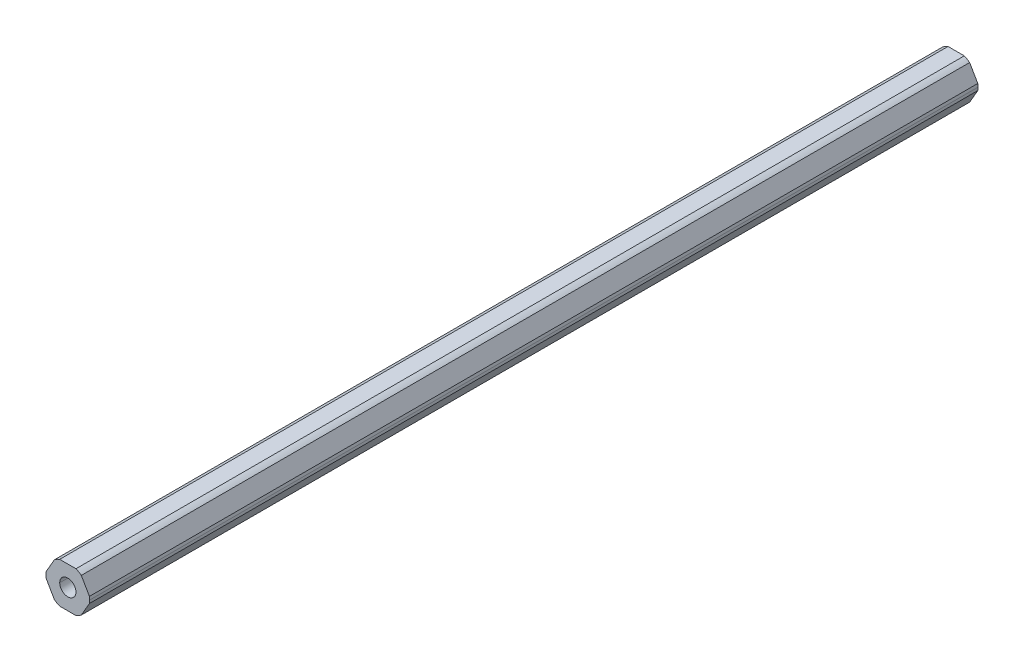
ISO-10303-21;
HEADER;
FILE_DESCRIPTION(('STEP AP214'),'2;1');
FILE_NAME('part.step','',(''),(''),'','','');
FILE_SCHEMA(('AUTOMOTIVE_DESIGN { 1 0 10303 214 1 1 1 1 }'));
ENDSEC;
DATA;
#1=APPLICATION_CONTEXT('core data for automotive mechanical design processes');
#2=APPLICATION_PROTOCOL_DEFINITION('international standard','automotive_design',2000,#1);
#3=PRODUCT_CONTEXT('',#1,'mechanical');
#4=PRODUCT('Part','Part','',(#3));
#5=PRODUCT_RELATED_PRODUCT_CATEGORY('part','',(#4));
#6=PRODUCT_DEFINITION_FORMATION('','',#4);
#7=PRODUCT_DEFINITION_CONTEXT('part definition',#1,'design');
#8=PRODUCT_DEFINITION('design','',#6,#7);
#9=PRODUCT_DEFINITION_SHAPE('','',#8);
#10=(LENGTH_UNIT() NAMED_UNIT(*) SI_UNIT(.MILLI.,.METRE.));
#11=(NAMED_UNIT(*) PLANE_ANGLE_UNIT() SI_UNIT($,.RADIAN.));
#12=(NAMED_UNIT(*) SI_UNIT($,.STERADIAN.) SOLID_ANGLE_UNIT());
#13=UNCERTAINTY_MEASURE_WITH_UNIT(LENGTH_MEASURE(1.E-05),#10,'distance_accuracy_value','');
#14=(GEOMETRIC_REPRESENTATION_CONTEXT(3) GLOBAL_UNCERTAINTY_ASSIGNED_CONTEXT((#13)) GLOBAL_UNIT_ASSIGNED_CONTEXT((#10,
#11,#12)) REPRESENTATION_CONTEXT('',''));
#15=CARTESIAN_POINT('',(0.,0.,0.));
#16=DIRECTION('',(0.,0.,1.));
#17=DIRECTION('',(1.,0.,0.));
#18=AXIS2_PLACEMENT_3D('',#15,#16,#17);
#19=CARTESIAN_POINT('',(0.,0.,-228.6));
#20=DIRECTION('',(0.,0.,1.));
#21=DIRECTION('',(1.,0.,0.));
#22=AXIS2_PLACEMENT_3D('',#19,#20,#21);
#23=CYLINDRICAL_SURFACE('',#22,2.55);
#24=CARTESIAN_POINT('',(0.,0.,-50.8));
#25=DIRECTION('',(0.,0.,-1.));
#26=DIRECTION('',(-1.,0.,0.));
#27=AXIS2_PLACEMENT_3D('',#24,#25,#26);
#28=CIRCLE('',#27,2.55);
#29=CARTESIAN_POINT('',(-2.55,0.,-50.8));
#30=VERTEX_POINT('',#29);
#31=CARTESIAN_POINT('',(2.55,0.,-50.8));
#32=VERTEX_POINT('',#31);
#33=EDGE_CURVE('E55',#30,#32,#28,.F.);
#34=ORIENTED_EDGE('',*,*,#33,.F.);
#35=DIRECTION('',(0.,0.,1.));
#36=VECTOR('',#35,1.);
#37=CARTESIAN_POINT('',(-2.55,0.,-228.6));
#38=LINE('',#37,#36);
#39=CARTESIAN_POINT('',(-2.55,0.,228.6));
#40=VERTEX_POINT('',#39);
#41=EDGE_CURVE('E42',#30,#40,#38,.T.);
#42=ORIENTED_EDGE('',*,*,#41,.T.);
#43=CARTESIAN_POINT('',(0.,0.,228.6));
#44=DIRECTION('',(0.,0.,1.));
#45=DIRECTION('',(1.,0.,0.));
#46=AXIS2_PLACEMENT_3D('',#43,#44,#45);
#47=CIRCLE('',#46,2.55);
#48=CARTESIAN_POINT('',(2.55,0.,228.6));
#49=VERTEX_POINT('',#48);
#50=EDGE_CURVE('E166',#40,#49,#47,.T.);
#51=ORIENTED_EDGE('',*,*,#50,.T.);
#52=DIRECTION('',(0.,0.,1.));
#53=VECTOR('',#52,1.);
#54=CARTESIAN_POINT('',(2.55,0.,-228.6));
#55=LINE('',#54,#53);
#56=EDGE_CURVE('E159',#32,#49,#55,.T.);
#57=ORIENTED_EDGE('',*,*,#56,.F.);
#58=EDGE_LOOP('',(#34,#42,#51,#57));
#59=FACE_BOUND('',#58,.T.);
#60=ADVANCED_FACE('F34',(#59),#23,.F.);
#61=CARTESIAN_POINT('',(0.,0.,-228.6));
#62=DIRECTION('',(0.,0.,1.));
#63=DIRECTION('',(1.,0.,0.));
#64=AXIS2_PLACEMENT_3D('',#61,#62,#63);
#65=CYLINDRICAL_SURFACE('',#64,6.87);
#66=DIRECTION('',(0.,0.,-1.));
#67=VECTOR('',#66,1.);
#68=CARTESIAN_POINT('',(6.80102150534208,-0.971085209378962,-228.6));
#69=LINE('',#68,#67);
#70=CARTESIAN_POINT('',(6.80102150534208,-0.971085209378955,228.6));
#71=VERTEX_POINT('',#70);
#72=CARTESIAN_POINT('',(6.80102150534208,-0.971085209378955,-50.8));
#73=VERTEX_POINT('',#72);
#74=EDGE_CURVE('E197',#71,#73,#69,.T.);
#75=ORIENTED_EDGE('',*,*,#74,.T.);
#76=CARTESIAN_POINT('',(0.,0.,-50.8));
#77=DIRECTION('',(0.,0.,-1.));
#78=DIRECTION('',(-1.,0.,0.));
#79=AXIS2_PLACEMENT_3D('',#76,#77,#78);
#80=CIRCLE('',#79,6.87);
#81=CARTESIAN_POINT('',(6.87,0.,-50.8));
#82=VERTEX_POINT('',#81);
#83=EDGE_CURVE('E302',#73,#82,#80,.F.);
#84=ORIENTED_EDGE('',*,*,#83,.T.);
#85=DIRECTION('',(0.,0.,1.));
#86=VECTOR('',#85,1.);
#87=CARTESIAN_POINT('',(6.87,0.,-228.6));
#88=LINE('',#87,#86);
#89=CARTESIAN_POINT('',(6.87,0.,228.6));
#90=VERTEX_POINT('',#89);
#91=EDGE_CURVE('E169',#82,#90,#88,.T.);
#92=ORIENTED_EDGE('',*,*,#91,.T.);
#93=CARTESIAN_POINT('',(0.,0.,228.6));
#94=DIRECTION('',(0.,0.,1.));
#95=DIRECTION('',(1.,0.,0.));
#96=AXIS2_PLACEMENT_3D('',#93,#94,#95);
#97=CIRCLE('',#96,6.87);
#98=EDGE_CURVE('E181',#71,#90,#97,.T.);
#99=ORIENTED_EDGE('',*,*,#98,.F.);
#100=EDGE_LOOP('',(#75,#84,#92,#99));
#101=FACE_BOUND('',#100,.T.);
#102=ADVANCED_FACE('F300',(#101),#65,.T.);
#103=CARTESIAN_POINT('',(3.68083890619154,-6.3754,228.6));
#104=DIRECTION('',(-0.866025403784439,0.5,0.));
#105=DIRECTION('',(0.,0.,1.));
#106=AXIS2_PLACEMENT_3D('',#103,#104,#105);
#107=PLANE('',#106);
#108=DIRECTION('',(-0.5,-0.866025403784439,0.));
#109=VECTOR('',#108,1.);
#110=CARTESIAN_POINT('',(3.68083890619154,-6.3754,-50.8));
#111=LINE('',#110,#109);
#112=CARTESIAN_POINT('',(4.24149521323254,-5.40431479062105,-50.8));
#113=VERTEX_POINT('',#112);
#114=EDGE_CURVE('E314',#73,#113,#111,.T.);
#115=ORIENTED_EDGE('',*,*,#114,.F.);
#116=ORIENTED_EDGE('',*,*,#74,.F.);
#117=DIRECTION('',(0.5,0.866025403784439,0.));
#118=VECTOR('',#117,1.);
#119=CARTESIAN_POINT('',(3.68083890619154,-6.3754,228.6));
#120=LINE('',#119,#118);
#121=CARTESIAN_POINT('',(4.24149521323254,-5.40431479062105,228.6));
#122=VERTEX_POINT('',#121);
#123=EDGE_CURVE('E185',#122,#71,#120,.T.);
#124=ORIENTED_EDGE('',*,*,#123,.F.);
#125=DIRECTION('',(0.,0.,1.));
#126=VECTOR('',#125,1.);
#127=CARTESIAN_POINT('',(4.24149521323255,-5.40431479062104,-228.6));
#128=LINE('',#127,#126);
#129=EDGE_CURVE('E204',#113,#122,#128,.T.);
#130=ORIENTED_EDGE('',*,*,#129,.F.);
#131=EDGE_LOOP('',(#115,#116,#124,#130));
#132=FACE_BOUND('',#131,.T.);
#133=ADVANCED_FACE('F359',(#132),#107,.F.);
#134=CARTESIAN_POINT('',(7.36167781238308,0.,228.6));
#135=DIRECTION('',(-0.866025403784439,-0.5,0.));
#136=DIRECTION('',(-0.5,0.866025403784439,0.));
#137=AXIS2_PLACEMENT_3D('',#134,#135,#136);
#138=PLANE('',#137);
#139=DIRECTION('',(0.5,-0.866025403784439,0.));
#140=VECTOR('',#139,1.);
#141=CARTESIAN_POINT('',(7.36167781238308,0.,-50.8));
#142=LINE('',#141,#140);
#143=CARTESIAN_POINT('',(4.24149521323254,5.40431479062105,-50.8));
#144=VERTEX_POINT('',#143);
#145=CARTESIAN_POINT('',(6.80102150534208,0.97108520937895,-50.8));
#146=VERTEX_POINT('',#145);
#147=EDGE_CURVE('E279',#144,#146,#142,.T.);
#148=ORIENTED_EDGE('',*,*,#147,.F.);
#149=DIRECTION('',(0.,0.,-1.));
#150=VECTOR('',#149,1.);
#151=CARTESIAN_POINT('',(4.24149521323254,5.40431479062105,-228.6));
#152=LINE('',#151,#150);
#153=CARTESIAN_POINT('',(4.24149521323254,5.40431479062105,228.6));
#154=VERTEX_POINT('',#153);
#155=EDGE_CURVE('E175',#154,#144,#152,.T.);
#156=ORIENTED_EDGE('',*,*,#155,.F.);
#157=DIRECTION('',(-0.5,0.866025403784439,0.));
#158=VECTOR('',#157,1.);
#159=CARTESIAN_POINT('',(7.36167781238308,0.,228.6));
#160=LINE('',#159,#158);
#161=CARTESIAN_POINT('',(6.80102150534208,0.97108520937895,228.6));
#162=VERTEX_POINT('',#161);
#163=EDGE_CURVE('E193',#162,#154,#160,.T.);
#164=ORIENTED_EDGE('',*,*,#163,.F.);
#165=DIRECTION('',(0.,0.,1.));
#166=VECTOR('',#165,1.);
#167=CARTESIAN_POINT('',(6.80102150534208,0.971085209378949,-228.6));
#168=LINE('',#167,#166);
#169=EDGE_CURVE('E203',#146,#162,#168,.T.);
#170=ORIENTED_EDGE('',*,*,#169,.F.);
#171=EDGE_LOOP('',(#148,#156,#164,#170));
#172=FACE_BOUND('',#171,.T.);
#173=ADVANCED_FACE('F278',(#172),#138,.F.);
#174=CARTESIAN_POINT('',(3.68083890619154,6.3754,228.6));
#175=DIRECTION('',(0.,-1.,0.));
#176=DIRECTION('',(0.,0.,-1.));
#177=AXIS2_PLACEMENT_3D('',#174,#175,#176);
#178=PLANE('',#177);
#179=DIRECTION('',(1.,0.,0.));
#180=VECTOR('',#179,1.);
#181=CARTESIAN_POINT('',(3.68083890619154,6.3754,-50.8));
#182=LINE('',#181,#180);
#183=CARTESIAN_POINT('',(-2.55952629210953,6.3754,-50.8));
#184=VERTEX_POINT('',#183);
#185=CARTESIAN_POINT('',(2.55952629210952,6.3754,-50.8));
#186=VERTEX_POINT('',#185);
#187=EDGE_CURVE('E49',#184,#186,#182,.T.);
#188=ORIENTED_EDGE('',*,*,#187,.F.);
#189=DIRECTION('',(0.,0.,-1.));
#190=VECTOR('',#189,1.);
#191=CARTESIAN_POINT('',(-2.55952629210953,6.3754,-228.6));
#192=LINE('',#191,#190);
#193=CARTESIAN_POINT('',(-2.55952629210953,6.3754,228.6));
#194=VERTEX_POINT('',#193);
#195=EDGE_CURVE('E173',#194,#184,#192,.T.);
#196=ORIENTED_EDGE('',*,*,#195,.F.);
#197=DIRECTION('',(-1.,0.,0.));
#198=VECTOR('',#197,1.);
#199=CARTESIAN_POINT('',(3.68083890619154,6.3754,228.6));
#200=LINE('',#199,#198);
#201=CARTESIAN_POINT('',(2.55952629210952,6.3754,228.6));
#202=VERTEX_POINT('',#201);
#203=EDGE_CURVE('E202',#202,#194,#200,.T.);
#204=ORIENTED_EDGE('',*,*,#203,.F.);
#205=DIRECTION('',(0.,0.,1.));
#206=VECTOR('',#205,1.);
#207=CARTESIAN_POINT('',(2.55952629210952,6.3754,-228.6));
#208=LINE('',#207,#206);
#209=EDGE_CURVE('E180',#186,#202,#208,.T.);
#210=ORIENTED_EDGE('',*,*,#209,.F.);
#211=EDGE_LOOP('',(#188,#196,#204,#210));
#212=FACE_BOUND('',#211,.T.);
#213=ADVANCED_FACE('F345',(#212),#178,.F.);
#214=CARTESIAN_POINT('',(-3.68083890619154,6.3754,228.6));
#215=DIRECTION('',(0.866025403784439,-0.5,0.));
#216=DIRECTION('',(0.,0.,-1.));
#217=AXIS2_PLACEMENT_3D('',#214,#215,#216);
#218=PLANE('',#217);
#219=DIRECTION('',(0.5,0.866025403784439,0.));
#220=VECTOR('',#219,1.);
#221=CARTESIAN_POINT('',(-3.68083890619154,6.3754,-50.8));
#222=LINE('',#221,#220);
#223=CARTESIAN_POINT('',(-6.80102150534207,0.97108520937896,-50.8));
#224=VERTEX_POINT('',#223);
#225=CARTESIAN_POINT('',(-4.24149521323255,5.40431479062105,-50.8));
#226=VERTEX_POINT('',#225);
#227=EDGE_CURVE('E305',#224,#226,#222,.T.);
#228=ORIENTED_EDGE('',*,*,#227,.F.);
#229=DIRECTION('',(0.,0.,-1.));
#230=VECTOR('',#229,1.);
#231=CARTESIAN_POINT('',(-6.80102150534208,0.97108520937896,-228.6));
#232=LINE('',#231,#230);
#233=CARTESIAN_POINT('',(-6.80102150534208,0.97108520937896,228.6));
#234=VERTEX_POINT('',#233);
#235=EDGE_CURVE('E229',#234,#224,#232,.T.);
#236=ORIENTED_EDGE('',*,*,#235,.F.);
#237=DIRECTION('',(-0.5,-0.866025403784439,0.));
#238=VECTOR('',#237,1.);
#239=CARTESIAN_POINT('',(-3.68083890619154,6.3754,228.6));
#240=LINE('',#239,#238);
#241=CARTESIAN_POINT('',(-4.24149521323255,5.40431479062105,228.6));
#242=VERTEX_POINT('',#241);
#243=EDGE_CURVE('E249',#242,#234,#240,.T.);
#244=ORIENTED_EDGE('',*,*,#243,.F.);
#245=DIRECTION('',(0.,0.,1.));
#246=VECTOR('',#245,1.);
#247=CARTESIAN_POINT('',(-4.24149521323255,5.40431479062105,-228.6));
#248=LINE('',#247,#246);
#249=EDGE_CURVE('E179',#226,#242,#248,.T.);
#250=ORIENTED_EDGE('',*,*,#249,.F.);
#251=EDGE_LOOP('',(#228,#236,#244,#250));
#252=FACE_BOUND('',#251,.T.);
#253=ADVANCED_FACE('F339',(#252),#218,.F.);
#254=CARTESIAN_POINT('',(-7.36167781238308,0.,228.6));
#255=DIRECTION('',(0.866025403784439,0.5,0.));
#256=DIRECTION('',(0.,0.,-1.));
#257=AXIS2_PLACEMENT_3D('',#254,#255,#256);
#258=PLANE('',#257);
#259=DIRECTION('',(-0.5,0.866025403784439,0.));
#260=VECTOR('',#259,1.);
#261=CARTESIAN_POINT('',(-7.36167781238308,0.,-50.8));
#262=LINE('',#261,#260);
#263=CARTESIAN_POINT('',(-4.24149521323254,-5.40431479062105,-50.8));
#264=VERTEX_POINT('',#263);
#265=CARTESIAN_POINT('',(-6.80102150534208,-0.971085209378956,-50.8));
#266=VERTEX_POINT('',#265);
#267=EDGE_CURVE('E308',#264,#266,#262,.T.);
#268=ORIENTED_EDGE('',*,*,#267,.F.);
#269=DIRECTION('',(0.,0.,-1.));
#270=VECTOR('',#269,1.);
#271=CARTESIAN_POINT('',(-4.24149521323255,-5.40431479062104,-228.6));
#272=LINE('',#271,#270);
#273=CARTESIAN_POINT('',(-4.24149521323254,-5.40431479062105,228.6));
#274=VERTEX_POINT('',#273);
#275=EDGE_CURVE('E238',#274,#264,#272,.T.);
#276=ORIENTED_EDGE('',*,*,#275,.F.);
#277=DIRECTION('',(0.5,-0.866025403784439,0.));
#278=VECTOR('',#277,1.);
#279=CARTESIAN_POINT('',(-7.36167781238308,0.,228.6));
#280=LINE('',#279,#278);
#281=CARTESIAN_POINT('',(-6.80102150534208,-0.971085209378956,228.6));
#282=VERTEX_POINT('',#281);
#283=EDGE_CURVE('E187',#282,#274,#280,.T.);
#284=ORIENTED_EDGE('',*,*,#283,.F.);
#285=DIRECTION('',(0.,0.,1.));
#286=VECTOR('',#285,1.);
#287=CARTESIAN_POINT('',(-6.80102150534208,-0.971085209378962,-228.6));
#288=LINE('',#287,#286);
#289=EDGE_CURVE('E233',#266,#282,#288,.T.);
#290=ORIENTED_EDGE('',*,*,#289,.F.);
#291=EDGE_LOOP('',(#268,#276,#284,#290));
#292=FACE_BOUND('',#291,.T.);
#293=ADVANCED_FACE('F334',(#292),#258,.F.);
#294=CARTESIAN_POINT('',(-3.68083890619154,-6.3754,228.6));
#295=DIRECTION('',(0.,1.,0.));
#296=DIRECTION('',(1.,0.,0.));
#297=AXIS2_PLACEMENT_3D('',#294,#295,#296);
#298=PLANE('',#297);
#299=DIRECTION('',(-1.,0.,0.));
#300=VECTOR('',#299,1.);
#301=CARTESIAN_POINT('',(-3.68083890619154,-6.3754,-50.8));
#302=LINE('',#301,#300);
#303=CARTESIAN_POINT('',(2.55952629210953,-6.3754,-50.8));
#304=VERTEX_POINT('',#303);
#305=CARTESIAN_POINT('',(-2.55952629210953,-6.3754,-50.8));
#306=VERTEX_POINT('',#305);
#307=EDGE_CURVE('E254',#304,#306,#302,.T.);
#308=ORIENTED_EDGE('',*,*,#307,.F.);
#309=DIRECTION('',(0.,0.,-1.));
#310=VECTOR('',#309,1.);
#311=CARTESIAN_POINT('',(2.55952629210953,-6.3754,-228.6));
#312=LINE('',#311,#310);
#313=CARTESIAN_POINT('',(2.55952629210953,-6.3754,228.6));
#314=VERTEX_POINT('',#313);
#315=EDGE_CURVE('E242',#314,#304,#312,.T.);
#316=ORIENTED_EDGE('',*,*,#315,.F.);
#317=DIRECTION('',(1.,0.,0.));
#318=VECTOR('',#317,1.);
#319=CARTESIAN_POINT('',(-3.68083890619154,-6.3754,228.6));
#320=LINE('',#319,#318);
#321=CARTESIAN_POINT('',(-2.55952629210953,-6.3754,228.6));
#322=VERTEX_POINT('',#321);
#323=EDGE_CURVE('E205',#322,#314,#320,.T.);
#324=ORIENTED_EDGE('',*,*,#323,.F.);
#325=DIRECTION('',(0.,0.,1.));
#326=VECTOR('',#325,1.);
#327=CARTESIAN_POINT('',(-2.55952629210953,-6.3754,-228.6));
#328=LINE('',#327,#326);
#329=EDGE_CURVE('E226',#306,#322,#328,.T.);
#330=ORIENTED_EDGE('',*,*,#329,.F.);
#331=EDGE_LOOP('',(#308,#316,#324,#330));
#332=FACE_BOUND('',#331,.T.);
#333=ADVANCED_FACE('F329',(#332),#298,.F.);
#334=CARTESIAN_POINT('',(0.,0.,-228.6));
#335=DIRECTION('',(0.,0.,1.));
#336=DIRECTION('',(1.,0.,0.));
#337=AXIS2_PLACEMENT_3D('',#334,#335,#336);
#338=CYLINDRICAL_SURFACE('',#337,6.87);
#339=ORIENTED_EDGE('',*,*,#91,.F.);
#340=CARTESIAN_POINT('',(0.,0.,-50.8));
#341=DIRECTION('',(0.,0.,-1.));
#342=DIRECTION('',(-1.,0.,0.));
#343=AXIS2_PLACEMENT_3D('',#340,#341,#342);
#344=CIRCLE('',#343,6.87);
#345=EDGE_CURVE('E275',#82,#146,#344,.F.);
#346=ORIENTED_EDGE('',*,*,#345,.T.);
#347=ORIENTED_EDGE('',*,*,#169,.T.);
#348=CARTESIAN_POINT('',(0.,0.,228.6));
#349=DIRECTION('',(0.,0.,1.));
#350=DIRECTION('',(1.,0.,0.));
#351=AXIS2_PLACEMENT_3D('',#348,#349,#350);
#352=CIRCLE('',#351,6.87);
#353=EDGE_CURVE('E186',#90,#162,#352,.T.);
#354=ORIENTED_EDGE('',*,*,#353,.F.);
#355=EDGE_LOOP('',(#339,#346,#347,#354));
#356=FACE_BOUND('',#355,.T.);
#357=ADVANCED_FACE('F272',(#356),#338,.T.);
#358=CARTESIAN_POINT('',(0.,0.,-228.6));
#359=DIRECTION('',(0.,0.,1.));
#360=DIRECTION('',(1.,0.,0.));
#361=AXIS2_PLACEMENT_3D('',#358,#359,#360);
#362=CYLINDRICAL_SURFACE('',#361,6.87);
#363=ORIENTED_EDGE('',*,*,#315,.T.);
#364=CARTESIAN_POINT('',(0.,0.,-50.8));
#365=DIRECTION('',(0.,0.,-1.));
#366=DIRECTION('',(-1.,0.,0.));
#367=AXIS2_PLACEMENT_3D('',#364,#365,#366);
#368=CIRCLE('',#367,6.87);
#369=EDGE_CURVE('E318',#304,#113,#368,.F.);
#370=ORIENTED_EDGE('',*,*,#369,.T.);
#371=ORIENTED_EDGE('',*,*,#129,.T.);
#372=CARTESIAN_POINT('',(0.,0.,228.6));
#373=DIRECTION('',(0.,0.,1.));
#374=DIRECTION('',(1.,0.,0.));
#375=AXIS2_PLACEMENT_3D('',#372,#373,#374);
#376=CIRCLE('',#375,6.87);
#377=EDGE_CURVE('E208',#314,#122,#376,.T.);
#378=ORIENTED_EDGE('',*,*,#377,.F.);
#379=EDGE_LOOP('',(#363,#370,#371,#378));
#380=FACE_BOUND('',#379,.T.);
#381=ADVANCED_FACE('F375',(#380),#362,.T.);
#382=CARTESIAN_POINT('',(0.,0.,-228.6));
#383=DIRECTION('',(0.,0.,1.));
#384=DIRECTION('',(1.,0.,0.));
#385=AXIS2_PLACEMENT_3D('',#382,#383,#384);
#386=CYLINDRICAL_SURFACE('',#385,6.87);
#387=ORIENTED_EDGE('',*,*,#275,.T.);
#388=CARTESIAN_POINT('',(0.,0.,-50.8));
#389=DIRECTION('',(0.,0.,-1.));
#390=DIRECTION('',(-1.,0.,0.));
#391=AXIS2_PLACEMENT_3D('',#388,#389,#390);
#392=CIRCLE('',#391,6.87);
#393=EDGE_CURVE('E316',#264,#306,#392,.F.);
#394=ORIENTED_EDGE('',*,*,#393,.T.);
#395=ORIENTED_EDGE('',*,*,#329,.T.);
#396=CARTESIAN_POINT('',(0.,0.,228.6));
#397=DIRECTION('',(0.,0.,1.));
#398=DIRECTION('',(1.,0.,0.));
#399=AXIS2_PLACEMENT_3D('',#396,#397,#398);
#400=CIRCLE('',#399,6.87);
#401=EDGE_CURVE('E192',#274,#322,#400,.T.);
#402=ORIENTED_EDGE('',*,*,#401,.F.);
#403=EDGE_LOOP('',(#387,#394,#395,#402));
#404=FACE_BOUND('',#403,.T.);
#405=ADVANCED_FACE('F327',(#404),#386,.T.);
#406=CARTESIAN_POINT('',(0.,0.,-228.6));
#407=DIRECTION('',(0.,0.,1.));
#408=DIRECTION('',(1.,0.,0.));
#409=AXIS2_PLACEMENT_3D('',#406,#407,#408);
#410=CYLINDRICAL_SURFACE('',#409,6.87);
#411=ORIENTED_EDGE('',*,*,#235,.T.);
#412=CARTESIAN_POINT('',(0.,0.,-50.8));
#413=DIRECTION('',(0.,0.,-1.));
#414=DIRECTION('',(-1.,0.,0.));
#415=AXIS2_PLACEMENT_3D('',#412,#413,#414);
#416=CIRCLE('',#415,6.87);
#417=EDGE_CURVE('E304',#224,#266,#416,.F.);
#418=ORIENTED_EDGE('',*,*,#417,.T.);
#419=ORIENTED_EDGE('',*,*,#289,.T.);
#420=CARTESIAN_POINT('',(0.,0.,228.6));
#421=DIRECTION('',(0.,0.,1.));
#422=DIRECTION('',(1.,0.,0.));
#423=AXIS2_PLACEMENT_3D('',#420,#421,#422);
#424=CIRCLE('',#423,6.87);
#425=EDGE_CURVE('E191',#234,#282,#424,.T.);
#426=ORIENTED_EDGE('',*,*,#425,.F.);
#427=EDGE_LOOP('',(#411,#418,#419,#426));
#428=FACE_BOUND('',#427,.T.);
#429=ADVANCED_FACE('F337',(#428),#410,.T.);
#430=CARTESIAN_POINT('',(0.,0.,-228.6));
#431=DIRECTION('',(0.,0.,1.));
#432=DIRECTION('',(1.,0.,0.));
#433=AXIS2_PLACEMENT_3D('',#430,#431,#432);
#434=CYLINDRICAL_SURFACE('',#433,6.87);
#435=ORIENTED_EDGE('',*,*,#195,.T.);
#436=CARTESIAN_POINT('',(0.,0.,-50.8));
#437=DIRECTION('',(0.,0.,-1.));
#438=DIRECTION('',(-1.,0.,0.));
#439=AXIS2_PLACEMENT_3D('',#436,#437,#438);
#440=CIRCLE('',#439,6.87);
#441=EDGE_CURVE('E340',#184,#226,#440,.F.);
#442=ORIENTED_EDGE('',*,*,#441,.T.);
#443=ORIENTED_EDGE('',*,*,#249,.T.);
#444=CARTESIAN_POINT('',(0.,0.,228.6));
#445=DIRECTION('',(0.,0.,1.));
#446=DIRECTION('',(1.,0.,0.));
#447=AXIS2_PLACEMENT_3D('',#444,#445,#446);
#448=CIRCLE('',#447,6.87);
#449=EDGE_CURVE('E258',#194,#242,#448,.T.);
#450=ORIENTED_EDGE('',*,*,#449,.F.);
#451=EDGE_LOOP('',(#435,#442,#443,#450));
#452=FACE_BOUND('',#451,.T.);
#453=ADVANCED_FACE('F289',(#452),#434,.T.);
#454=CARTESIAN_POINT('',(0.,0.,-228.6));
#455=DIRECTION('',(0.,0.,1.));
#456=DIRECTION('',(1.,0.,0.));
#457=AXIS2_PLACEMENT_3D('',#454,#455,#456);
#458=CYLINDRICAL_SURFACE('',#457,6.87);
#459=ORIENTED_EDGE('',*,*,#155,.T.);
#460=CARTESIAN_POINT('',(0.,0.,-50.8));
#461=DIRECTION('',(0.,0.,-1.));
#462=DIRECTION('',(-1.,0.,0.));
#463=AXIS2_PLACEMENT_3D('',#460,#461,#462);
#464=CIRCLE('',#463,6.87);
#465=EDGE_CURVE('E160',#144,#186,#464,.F.);
#466=ORIENTED_EDGE('',*,*,#465,.T.);
#467=ORIENTED_EDGE('',*,*,#209,.T.);
#468=CARTESIAN_POINT('',(0.,0.,228.6));
#469=DIRECTION('',(0.,0.,1.));
#470=DIRECTION('',(1.,0.,0.));
#471=AXIS2_PLACEMENT_3D('',#468,#469,#470);
#472=CIRCLE('',#471,6.87);
#473=EDGE_CURVE('E198',#154,#202,#472,.T.);
#474=ORIENTED_EDGE('',*,*,#473,.F.);
#475=EDGE_LOOP('',(#459,#466,#467,#474));
#476=FACE_BOUND('',#475,.T.);
#477=ADVANCED_FACE('F281',(#476),#458,.T.);
#478=CARTESIAN_POINT('',(0.,0.,-228.6));
#479=DIRECTION('',(0.,0.,1.));
#480=DIRECTION('',(1.,0.,0.));
#481=AXIS2_PLACEMENT_3D('',#478,#479,#480);
#482=CYLINDRICAL_SURFACE('',#481,2.55);
#483=CARTESIAN_POINT('',(0.,0.,-50.8));
#484=DIRECTION('',(0.,0.,-1.));
#485=DIRECTION('',(-1.,0.,0.));
#486=AXIS2_PLACEMENT_3D('',#483,#484,#485);
#487=CIRCLE('',#486,2.55);
#488=EDGE_CURVE('E11',#32,#30,#487,.F.);
#489=ORIENTED_EDGE('',*,*,#488,.F.);
#490=ORIENTED_EDGE('',*,*,#56,.T.);
#491=CARTESIAN_POINT('',(0.,0.,228.6));
#492=DIRECTION('',(0.,0.,1.));
#493=DIRECTION('',(1.,0.,0.));
#494=AXIS2_PLACEMENT_3D('',#491,#492,#493);
#495=CIRCLE('',#494,2.55);
#496=EDGE_CURVE('E165',#49,#40,#495,.T.);
#497=ORIENTED_EDGE('',*,*,#496,.T.);
#498=ORIENTED_EDGE('',*,*,#41,.F.);
#499=EDGE_LOOP('',(#489,#490,#497,#498));
#500=FACE_BOUND('',#499,.T.);
#501=ADVANCED_FACE('F163',(#500),#482,.F.);
#502=CARTESIAN_POINT('',(0.,0.,228.6));
#503=DIRECTION('',(0.,0.,1.));
#504=DIRECTION('',(1.,0.,0.));
#505=AXIS2_PLACEMENT_3D('',#502,#503,#504);
#506=PLANE('',#505);
#507=ORIENTED_EDGE('',*,*,#163,.T.);
#508=ORIENTED_EDGE('',*,*,#473,.T.);
#509=ORIENTED_EDGE('',*,*,#203,.T.);
#510=ORIENTED_EDGE('',*,*,#449,.T.);
#511=ORIENTED_EDGE('',*,*,#243,.T.);
#512=ORIENTED_EDGE('',*,*,#425,.T.);
#513=ORIENTED_EDGE('',*,*,#283,.T.);
#514=ORIENTED_EDGE('',*,*,#401,.T.);
#515=ORIENTED_EDGE('',*,*,#323,.T.);
#516=ORIENTED_EDGE('',*,*,#377,.T.);
#517=ORIENTED_EDGE('',*,*,#123,.T.);
#518=ORIENTED_EDGE('',*,*,#98,.T.);
#519=ORIENTED_EDGE('',*,*,#353,.T.);
#520=EDGE_LOOP('',(#507,#508,#509,#510,#511,#512,#513,#514,#515,#516,#517,#518,#519));
#521=FACE_BOUND('',#520,.T.);
#522=ORIENTED_EDGE('',*,*,#496,.F.);
#523=ORIENTED_EDGE('',*,*,#50,.F.);
#524=EDGE_LOOP('',(#522,#523));
#525=FACE_BOUND('',#524,.T.);
#526=ADVANCED_FACE('F36',(#521,#525),#506,.T.);
#527=CARTESIAN_POINT('',(0.,0.,-50.8));
#528=DIRECTION('',(0.,0.,-1.));
#529=DIRECTION('',(-1.,0.,0.));
#530=AXIS2_PLACEMENT_3D('',#527,#528,#529);
#531=PLANE('',#530);
#532=ORIENTED_EDGE('',*,*,#33,.T.);
#533=ORIENTED_EDGE('',*,*,#488,.T.);
#534=EDGE_LOOP('',(#532,#533));
#535=FACE_BOUND('',#534,.T.);
#536=ORIENTED_EDGE('',*,*,#307,.T.);
#537=ORIENTED_EDGE('',*,*,#393,.F.);
#538=ORIENTED_EDGE('',*,*,#267,.T.);
#539=ORIENTED_EDGE('',*,*,#417,.F.);
#540=ORIENTED_EDGE('',*,*,#227,.T.);
#541=ORIENTED_EDGE('',*,*,#441,.F.);
#542=ORIENTED_EDGE('',*,*,#187,.T.);
#543=ORIENTED_EDGE('',*,*,#465,.F.);
#544=ORIENTED_EDGE('',*,*,#147,.T.);
#545=ORIENTED_EDGE('',*,*,#345,.F.);
#546=ORIENTED_EDGE('',*,*,#83,.F.);
#547=ORIENTED_EDGE('',*,*,#114,.T.);
#548=ORIENTED_EDGE('',*,*,#369,.F.);
#549=EDGE_LOOP('',(#536,#537,#538,#539,#540,#541,#542,#543,#544,#545,#546,#547,#548));
#550=FACE_BOUND('',#549,.T.);
#551=ADVANCED_FACE('F152',(#535,#550),#531,.T.);
#552=CLOSED_SHELL('',(#60,#102,#133,#173,#213,#253,#293,#333,#357,#381,#405,#429,#453,#477,#501,
#526,#551));
#553=MANIFOLD_SOLID_BREP('B2',#552);
#554=ADVANCED_BREP_SHAPE_REPRESENTATION('',(#18,#553),#14);
#555=SHAPE_DEFINITION_REPRESENTATION(#9,#554);
ENDSEC;
END-ISO-10303-21;
